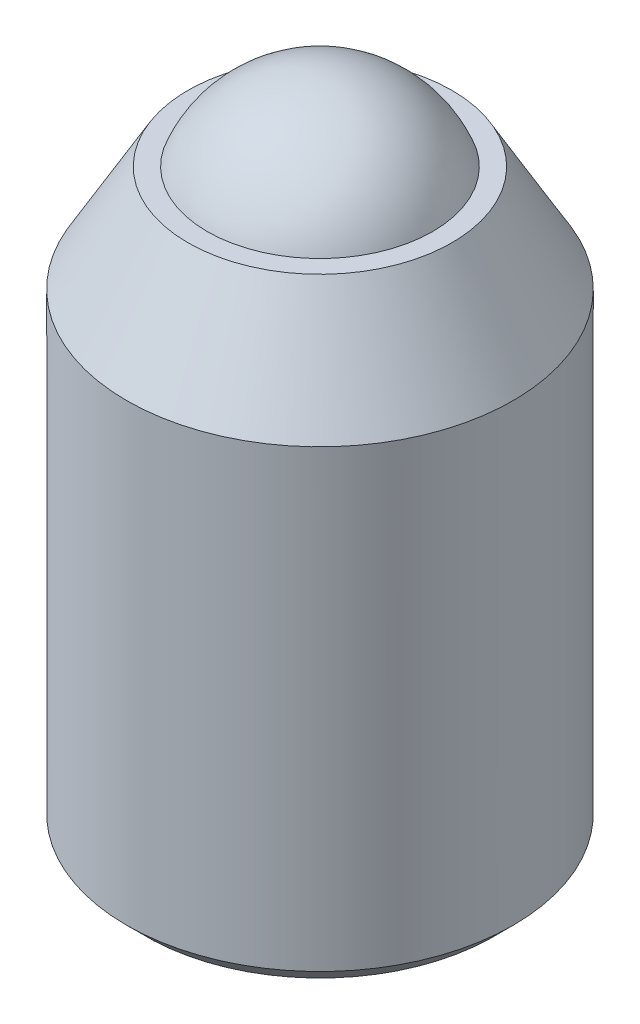
ISO-10303-21;
HEADER;
FILE_DESCRIPTION(('STEP AP214'),'2;1');
FILE_NAME('part.step','',(''),(''),'','','');
FILE_SCHEMA(('AUTOMOTIVE_DESIGN { 1 0 10303 214 1 1 1 1 }'));
ENDSEC;
DATA;
#1=APPLICATION_CONTEXT('core data for automotive mechanical design processes');
#2=APPLICATION_PROTOCOL_DEFINITION('international standard','automotive_design',2000,#1);
#3=PRODUCT_CONTEXT('',#1,'mechanical');
#4=PRODUCT('Part','Part','',(#3));
#5=PRODUCT_RELATED_PRODUCT_CATEGORY('part','',(#4));
#6=PRODUCT_DEFINITION_FORMATION('','',#4);
#7=PRODUCT_DEFINITION_CONTEXT('part definition',#1,'design');
#8=PRODUCT_DEFINITION('design','',#6,#7);
#9=PRODUCT_DEFINITION_SHAPE('','',#8);
#10=(LENGTH_UNIT() NAMED_UNIT(*) SI_UNIT(.MILLI.,.METRE.));
#11=(NAMED_UNIT(*) PLANE_ANGLE_UNIT() SI_UNIT($,.RADIAN.));
#12=(NAMED_UNIT(*) SI_UNIT($,.STERADIAN.) SOLID_ANGLE_UNIT());
#13=UNCERTAINTY_MEASURE_WITH_UNIT(LENGTH_MEASURE(1.E-05),#10,'distance_accuracy_value','');
#14=(GEOMETRIC_REPRESENTATION_CONTEXT(3) GLOBAL_UNCERTAINTY_ASSIGNED_CONTEXT((#13)) GLOBAL_UNIT_ASSIGNED_CONTEXT((#10,
#11,#12)) REPRESENTATION_CONTEXT('',''));
#15=CARTESIAN_POINT('',(0.,0.,0.));
#16=DIRECTION('',(0.,0.,1.));
#17=DIRECTION('',(1.,0.,0.));
#18=AXIS2_PLACEMENT_3D('',#15,#16,#17);
#19=CARTESIAN_POINT('',(0.,5.55,0.));
#20=DIRECTION('',(0.,1.,0.));
#21=DIRECTION('',(1.,0.,0.));
#22=AXIS2_PLACEMENT_3D('',#19,#20,#21);
#23=SPHERICAL_SURFACE('',#22,1.25);
#24=CARTESIAN_POINT('',(0.,6.,0.));
#25=DIRECTION('',(0.,1.,0.));
#26=DIRECTION('',(0.,0.,1.));
#27=AXIS2_PLACEMENT_3D('',#24,#25,#26);
#28=CIRCLE('',#27,1.16619037896906);
#29=CARTESIAN_POINT('',(0.,6.,1.16619037896906));
#30=VERTEX_POINT('',#29);
#31=EDGE_CURVE('E157',#30,#30,#28,.T.);
#32=ORIENTED_EDGE('',*,*,#31,.T.);
#33=EDGE_LOOP('',(#32));
#34=FACE_BOUND('',#33,.T.);
#35=ADVANCED_FACE('F35',(#34),#23,.T.);
#36=CARTESIAN_POINT('',(-1.36619037896906,6.,0.));
#37=DIRECTION('',(0.,1.,0.));
#38=DIRECTION('',(0.,0.,1.));
#39=AXIS2_PLACEMENT_3D('',#36,#37,#38);
#40=PLANE('',#39);
#41=CARTESIAN_POINT('',(0.,6.,0.));
#42=DIRECTION('',(0.,1.,0.));
#43=DIRECTION('',(0.,0.,1.));
#44=AXIS2_PLACEMENT_3D('',#41,#42,#43);
#45=CIRCLE('',#44,1.36619037896906);
#46=CARTESIAN_POINT('',(0.,6.,1.36619037896906));
#47=VERTEX_POINT('',#46);
#48=EDGE_CURVE('E154',#47,#47,#45,.T.);
#49=ORIENTED_EDGE('',*,*,#48,.T.);
#50=EDGE_LOOP('',(#49));
#51=FACE_BOUND('',#50,.T.);
#52=ORIENTED_EDGE('',*,*,#31,.F.);
#53=EDGE_LOOP('',(#52));
#54=FACE_BOUND('',#53,.T.);
#55=ADVANCED_FACE('F231',(#51,#54),#40,.T.);
#56=CARTESIAN_POINT('',(0.,6.,0.));
#57=DIRECTION('',(0.,-1.,0.));
#58=DIRECTION('',(0.,0.,-1.));
#59=AXIS2_PLACEMENT_3D('',#56,#57,#58);
#60=CONICAL_SURFACE('',#59,1.36619037896906,0.5235987755983);
#61=CARTESIAN_POINT('',(0.,4.90220953404844,0.));
#62=DIRECTION('',(0.,1.,0.));
#63=DIRECTION('',(0.,0.,1.));
#64=AXIS2_PLACEMENT_3D('',#61,#62,#63);
#65=CIRCLE('',#64,2.);
#66=CARTESIAN_POINT('',(0.,4.90220953404844,2.));
#67=VERTEX_POINT('',#66);
#68=EDGE_CURVE('E142',#67,#67,#65,.T.);
#69=ORIENTED_EDGE('',*,*,#68,.T.);
#70=EDGE_LOOP('',(#69));
#71=FACE_BOUND('',#70,.T.);
#72=ORIENTED_EDGE('',*,*,#48,.F.);
#73=EDGE_LOOP('',(#72));
#74=FACE_BOUND('',#73,.T.);
#75=ADVANCED_FACE('F237',(#71,#74),#60,.T.);
#76=CARTESIAN_POINT('',(0.,6.8,0.));
#77=DIRECTION('',(0.,1.,0.));
#78=DIRECTION('',(0.,0.,1.));
#79=AXIS2_PLACEMENT_3D('',#76,#77,#78);
#80=CYLINDRICAL_SURFACE('',#79,2.);
#81=CARTESIAN_POINT('',(0.,0.200000000000001,0.));
#82=DIRECTION('',(0.,-1.,0.));
#83=DIRECTION('',(0.,0.,-1.));
#84=AXIS2_PLACEMENT_3D('',#81,#82,#83);
#85=CIRCLE('',#84,2.);
#86=CARTESIAN_POINT('',(0.,0.200000000000001,-2.));
#87=VERTEX_POINT('',#86);
#88=EDGE_CURVE('E160',#87,#87,#85,.F.);
#89=ORIENTED_EDGE('',*,*,#88,.T.);
#90=EDGE_LOOP('',(#89));
#91=FACE_BOUND('',#90,.T.);
#92=ORIENTED_EDGE('',*,*,#68,.F.);
#93=EDGE_LOOP('',(#92));
#94=FACE_BOUND('',#93,.T.);
#95=ADVANCED_FACE('F342',(#91,#94),#80,.T.);
#96=CARTESIAN_POINT('',(0.,0.,0.));
#97=DIRECTION('',(0.,-1.,0.));
#98=DIRECTION('',(0.,0.,-1.));
#99=AXIS2_PLACEMENT_3D('',#96,#97,#98);
#100=PLANE('',#99);
#101=DIRECTION('',(-1.,0.,0.));
#102=VECTOR('',#101,1.);
#103=CARTESIAN_POINT('',(-0.577350269189626,0.,-1.25));
#104=LINE('',#103,#102);
#105=CARTESIAN_POINT('',(0.721687836487033,0.,-1.25));
#106=VERTEX_POINT('',#105);
#107=CARTESIAN_POINT('',(-0.721687836487033,0.,-1.25));
#108=VERTEX_POINT('',#107);
#109=EDGE_CURVE('E177',#106,#108,#104,.T.);
#110=ORIENTED_EDGE('',*,*,#109,.T.);
#111=DIRECTION('',(-0.5,0.,0.866025403784439));
#112=VECTOR('',#111,1.);
#113=CARTESIAN_POINT('',(-1.37120688932536,0.,-0.125000000000001));
#114=LINE('',#113,#112);
#115=CARTESIAN_POINT('',(-1.44337567297407,0.,0.));
#116=VERTEX_POINT('',#115);
#117=EDGE_CURVE('E179',#108,#116,#114,.T.);
#118=ORIENTED_EDGE('',*,*,#117,.T.);
#119=DIRECTION('',(0.5,0.,0.866025403784439));
#120=VECTOR('',#119,1.);
#121=CARTESIAN_POINT('',(-0.793856620135737,0.,1.125));
#122=LINE('',#121,#120);
#123=CARTESIAN_POINT('',(-0.721687836487033,0.,1.25));
#124=VERTEX_POINT('',#123);
#125=EDGE_CURVE('E169',#116,#124,#122,.T.);
#126=ORIENTED_EDGE('',*,*,#125,.T.);
#127=DIRECTION('',(1.,0.,0.));
#128=VECTOR('',#127,1.);
#129=CARTESIAN_POINT('',(0.577350269189625,0.,1.25));
#130=LINE('',#129,#128);
#131=CARTESIAN_POINT('',(0.721687836487033,0.,1.25));
#132=VERTEX_POINT('',#131);
#133=EDGE_CURVE('E171',#124,#132,#130,.T.);
#134=ORIENTED_EDGE('',*,*,#133,.T.);
#135=DIRECTION('',(0.5,0.,-0.866025403784439));
#136=VECTOR('',#135,1.);
#137=CARTESIAN_POINT('',(1.37120688932536,0.,0.125000000000001));
#138=LINE('',#137,#136);
#139=CARTESIAN_POINT('',(1.44337567297407,0.,0.));
#140=VERTEX_POINT('',#139);
#141=EDGE_CURVE('E173',#132,#140,#138,.T.);
#142=ORIENTED_EDGE('',*,*,#141,.T.);
#143=DIRECTION('',(-0.5,0.,-0.866025403784439));
#144=VECTOR('',#143,1.);
#145=CARTESIAN_POINT('',(0.793856620135736,0.,-1.125));
#146=LINE('',#145,#144);
#147=EDGE_CURVE('E175',#140,#106,#146,.T.);
#148=ORIENTED_EDGE('',*,*,#147,.T.);
#149=EDGE_LOOP('',(#110,#118,#126,#134,#142,#148));
#150=FACE_BOUND('',#149,.T.);
#151=CARTESIAN_POINT('',(0.,0.,0.));
#152=DIRECTION('',(0.,-1.,0.));
#153=DIRECTION('',(0.,0.,-1.));
#154=AXIS2_PLACEMENT_3D('',#151,#152,#153);
#155=CIRCLE('',#154,1.8);
#156=CARTESIAN_POINT('',(0.,0.,-1.8));
#157=VERTEX_POINT('',#156);
#158=EDGE_CURVE('E163',#157,#157,#155,.T.);
#159=ORIENTED_EDGE('',*,*,#158,.T.);
#160=EDGE_LOOP('',(#159));
#161=FACE_BOUND('',#160,.T.);
#162=ADVANCED_FACE('F245',(#150,#161),#100,.T.);
#163=CARTESIAN_POINT('',(0.,0.200000000000001,0.));
#164=DIRECTION('',(0.,1.,0.));
#165=DIRECTION('',(0.,0.,1.));
#166=AXIS2_PLACEMENT_3D('',#163,#164,#165);
#167=CONICAL_SURFACE('',#166,2.,0.785398163397448);
#168=ORIENTED_EDGE('',*,*,#158,.F.);
#169=EDGE_LOOP('',(#168));
#170=FACE_BOUND('',#169,.T.);
#171=ORIENTED_EDGE('',*,*,#88,.F.);
#172=EDGE_LOOP('',(#171));
#173=FACE_BOUND('',#172,.T.);
#174=ADVANCED_FACE('F242',(#170,#173),#167,.T.);
#175=CARTESIAN_POINT('',(0.577350269189626,1.5,-1.));
#176=DIRECTION('',(0.866025403784439,0.,-0.5));
#177=DIRECTION('',(-0.5,0.,-0.866025403784439));
#178=AXIS2_PLACEMENT_3D('',#175,#176,#177);
#179=PLANE('',#178);
#180=DIRECTION('',(0.,-1.,0.));
#181=VECTOR('',#180,1.);
#182=CARTESIAN_POINT('',(0.577350269189626,1.5,-1.));
#183=LINE('',#182,#181);
#184=CARTESIAN_POINT('',(0.577350269189626,1.5,-1.));
#185=VERTEX_POINT('',#184);
#186=CARTESIAN_POINT('',(0.577350269189626,0.250000000000001,-1.));
#187=VERTEX_POINT('',#186);
#188=EDGE_CURVE('E140',#185,#187,#183,.T.);
#189=ORIENTED_EDGE('',*,*,#188,.T.);
#190=DIRECTION('',(0.5,0.,0.866025403784439));
#191=VECTOR('',#190,1.);
#192=CARTESIAN_POINT('',(1.15470053837925,0.250000000000001,0.));
#193=LINE('',#192,#191);
#194=CARTESIAN_POINT('',(1.15470053837925,0.250000000000001,0.));
#195=VERTEX_POINT('',#194);
#196=EDGE_CURVE('E114',#187,#195,#193,.T.);
#197=ORIENTED_EDGE('',*,*,#196,.T.);
#198=DIRECTION('',(0.,-1.,0.));
#199=VECTOR('',#198,1.);
#200=CARTESIAN_POINT('',(1.15470053837925,1.5,0.));
#201=LINE('',#200,#199);
#202=CARTESIAN_POINT('',(1.15470053837925,1.5,0.));
#203=VERTEX_POINT('',#202);
#204=EDGE_CURVE('E106',#203,#195,#201,.T.);
#205=ORIENTED_EDGE('',*,*,#204,.F.);
#206=DIRECTION('',(0.5,0.,0.866025403784439));
#207=VECTOR('',#206,1.);
#208=CARTESIAN_POINT('',(0.577350269189626,1.5,-1.));
#209=LINE('',#208,#207);
#210=EDGE_CURVE('E111',#185,#203,#209,.T.);
#211=ORIENTED_EDGE('',*,*,#210,.F.);
#212=EDGE_LOOP('',(#189,#197,#205,#211));
#213=FACE_BOUND('',#212,.T.);
#214=ADVANCED_FACE('F109',(#213),#179,.F.);
#215=CARTESIAN_POINT('',(-0.577350269189626,1.5,-1.));
#216=DIRECTION('',(0.,0.,-1.));
#217=DIRECTION('',(-1.,0.,0.));
#218=AXIS2_PLACEMENT_3D('',#215,#216,#217);
#219=PLANE('',#218);
#220=DIRECTION('',(0.,-1.,0.));
#221=VECTOR('',#220,1.);
#222=CARTESIAN_POINT('',(-0.577350269189626,1.5,-1.));
#223=LINE('',#222,#221);
#224=CARTESIAN_POINT('',(-0.577350269189626,1.5,-1.));
#225=VERTEX_POINT('',#224);
#226=CARTESIAN_POINT('',(-0.577350269189626,0.250000000000001,-1.));
#227=VERTEX_POINT('',#226);
#228=EDGE_CURVE('E143',#225,#227,#223,.T.);
#229=ORIENTED_EDGE('',*,*,#228,.T.);
#230=DIRECTION('',(1.,0.,0.));
#231=VECTOR('',#230,1.);
#232=CARTESIAN_POINT('',(0.577350269189626,0.250000000000001,-1.));
#233=LINE('',#232,#231);
#234=EDGE_CURVE('E182',#227,#187,#233,.T.);
#235=ORIENTED_EDGE('',*,*,#234,.T.);
#236=ORIENTED_EDGE('',*,*,#188,.F.);
#237=DIRECTION('',(1.,0.,0.));
#238=VECTOR('',#237,1.);
#239=CARTESIAN_POINT('',(-0.577350269189626,1.5,-1.));
#240=LINE('',#239,#238);
#241=EDGE_CURVE('E116',#225,#185,#240,.T.);
#242=ORIENTED_EDGE('',*,*,#241,.F.);
#243=EDGE_LOOP('',(#229,#235,#236,#242));
#244=FACE_BOUND('',#243,.T.);
#245=ADVANCED_FACE('F269',(#244),#219,.F.);
#246=CARTESIAN_POINT('',(-1.15470053837925,1.5,0.));
#247=DIRECTION('',(-0.866025403784439,0.,-0.5));
#248=DIRECTION('',(-0.5,0.,0.866025403784439));
#249=AXIS2_PLACEMENT_3D('',#246,#247,#248);
#250=PLANE('',#249);
#251=DIRECTION('',(0.,-1.,0.));
#252=VECTOR('',#251,1.);
#253=CARTESIAN_POINT('',(-1.15470053837925,1.5,0.));
#254=LINE('',#253,#252);
#255=CARTESIAN_POINT('',(-1.15470053837925,1.5,0.));
#256=VERTEX_POINT('',#255);
#257=CARTESIAN_POINT('',(-1.15470053837925,0.250000000000001,0.));
#258=VERTEX_POINT('',#257);
#259=EDGE_CURVE('E146',#256,#258,#254,.T.);
#260=ORIENTED_EDGE('',*,*,#259,.T.);
#261=DIRECTION('',(0.5,0.,-0.866025403784439));
#262=VECTOR('',#261,1.);
#263=CARTESIAN_POINT('',(-0.577350269189626,0.250000000000001,-1.));
#264=LINE('',#263,#262);
#265=EDGE_CURVE('E166',#258,#227,#264,.T.);
#266=ORIENTED_EDGE('',*,*,#265,.T.);
#267=ORIENTED_EDGE('',*,*,#228,.F.);
#268=DIRECTION('',(0.5,0.,-0.866025403784439));
#269=VECTOR('',#268,1.);
#270=CARTESIAN_POINT('',(-1.15470053837925,1.5,0.));
#271=LINE('',#270,#269);
#272=EDGE_CURVE('E137',#256,#225,#271,.T.);
#273=ORIENTED_EDGE('',*,*,#272,.F.);
#274=EDGE_LOOP('',(#260,#266,#267,#273));
#275=FACE_BOUND('',#274,.T.);
#276=ADVANCED_FACE('F220',(#275),#250,.F.);
#277=CARTESIAN_POINT('',(-0.577350269189626,1.5,1.));
#278=DIRECTION('',(-0.866025403784439,0.,0.5));
#279=DIRECTION('',(0.5,0.,0.866025403784439));
#280=AXIS2_PLACEMENT_3D('',#277,#278,#279);
#281=PLANE('',#280);
#282=DIRECTION('',(0.,-1.,0.));
#283=VECTOR('',#282,1.);
#284=CARTESIAN_POINT('',(-0.577350269189626,1.5,1.));
#285=LINE('',#284,#283);
#286=CARTESIAN_POINT('',(-0.577350269189626,1.5,1.));
#287=VERTEX_POINT('',#286);
#288=CARTESIAN_POINT('',(-0.577350269189626,0.250000000000001,1.));
#289=VERTEX_POINT('',#288);
#290=EDGE_CURVE('E149',#287,#289,#285,.T.);
#291=ORIENTED_EDGE('',*,*,#290,.T.);
#292=DIRECTION('',(-0.5,0.,-0.866025403784439));
#293=VECTOR('',#292,1.);
#294=CARTESIAN_POINT('',(-1.15470053837925,0.250000000000001,0.));
#295=LINE('',#294,#293);
#296=EDGE_CURVE('E11',#289,#258,#295,.T.);
#297=ORIENTED_EDGE('',*,*,#296,.T.);
#298=ORIENTED_EDGE('',*,*,#259,.F.);
#299=DIRECTION('',(-0.5,0.,-0.866025403784439));
#300=VECTOR('',#299,1.);
#301=CARTESIAN_POINT('',(-0.577350269189626,1.5,1.));
#302=LINE('',#301,#300);
#303=EDGE_CURVE('E134',#287,#256,#302,.T.);
#304=ORIENTED_EDGE('',*,*,#303,.F.);
#305=EDGE_LOOP('',(#291,#297,#298,#304));
#306=FACE_BOUND('',#305,.T.);
#307=ADVANCED_FACE('F216',(#306),#281,.F.);
#308=CARTESIAN_POINT('',(0.577350269189625,1.5,1.));
#309=DIRECTION('',(0.,0.,1.));
#310=DIRECTION('',(1.,0.,0.));
#311=AXIS2_PLACEMENT_3D('',#308,#309,#310);
#312=PLANE('',#311);
#313=DIRECTION('',(0.,-1.,0.));
#314=VECTOR('',#313,1.);
#315=CARTESIAN_POINT('',(0.577350269189625,1.5,1.));
#316=LINE('',#315,#314);
#317=CARTESIAN_POINT('',(0.577350269189625,1.5,1.));
#318=VERTEX_POINT('',#317);
#319=CARTESIAN_POINT('',(0.577350269189625,0.250000000000001,1.));
#320=VERTEX_POINT('',#319);
#321=EDGE_CURVE('E115',#318,#320,#316,.T.);
#322=ORIENTED_EDGE('',*,*,#321,.T.);
#323=DIRECTION('',(-1.,0.,0.));
#324=VECTOR('',#323,1.);
#325=CARTESIAN_POINT('',(-0.577350269189626,0.250000000000001,1.));
#326=LINE('',#325,#324);
#327=EDGE_CURVE('E44',#320,#289,#326,.T.);
#328=ORIENTED_EDGE('',*,*,#327,.T.);
#329=ORIENTED_EDGE('',*,*,#290,.F.);
#330=DIRECTION('',(-1.,0.,0.));
#331=VECTOR('',#330,1.);
#332=CARTESIAN_POINT('',(0.577350269189625,1.5,1.));
#333=LINE('',#332,#331);
#334=EDGE_CURVE('E124',#318,#287,#333,.T.);
#335=ORIENTED_EDGE('',*,*,#334,.F.);
#336=EDGE_LOOP('',(#322,#328,#329,#335));
#337=FACE_BOUND('',#336,.T.);
#338=ADVANCED_FACE('F221',(#337),#312,.F.);
#339=CARTESIAN_POINT('',(1.15470053837925,1.5,0.));
#340=DIRECTION('',(0.866025403784439,0.,0.5));
#341=DIRECTION('',(0.5,0.,-0.866025403784439));
#342=AXIS2_PLACEMENT_3D('',#339,#340,#341);
#343=PLANE('',#342);
#344=ORIENTED_EDGE('',*,*,#204,.T.);
#345=DIRECTION('',(-0.5,0.,0.866025403784439));
#346=VECTOR('',#345,1.);
#347=CARTESIAN_POINT('',(0.577350269189625,0.250000000000001,1.));
#348=LINE('',#347,#346);
#349=EDGE_CURVE('E59',#195,#320,#348,.T.);
#350=ORIENTED_EDGE('',*,*,#349,.T.);
#351=ORIENTED_EDGE('',*,*,#321,.F.);
#352=DIRECTION('',(-0.5,0.,0.866025403784438));
#353=VECTOR('',#352,1.);
#354=CARTESIAN_POINT('',(1.15470053837925,1.5,0.));
#355=LINE('',#354,#353);
#356=EDGE_CURVE('E119',#203,#318,#355,.T.);
#357=ORIENTED_EDGE('',*,*,#356,.F.);
#358=EDGE_LOOP('',(#344,#350,#351,#357));
#359=FACE_BOUND('',#358,.T.);
#360=ADVANCED_FACE('F120',(#359),#343,.F.);
#361=CARTESIAN_POINT('',(0.,1.5,0.));
#362=DIRECTION('',(0.,-1.,0.));
#363=DIRECTION('',(0.,0.,-1.));
#364=AXIS2_PLACEMENT_3D('',#361,#362,#363);
#365=PLANE('',#364);
#366=ORIENTED_EDGE('',*,*,#210,.T.);
#367=ORIENTED_EDGE('',*,*,#356,.T.);
#368=ORIENTED_EDGE('',*,*,#334,.T.);
#369=ORIENTED_EDGE('',*,*,#303,.T.);
#370=ORIENTED_EDGE('',*,*,#272,.T.);
#371=ORIENTED_EDGE('',*,*,#241,.T.);
#372=EDGE_LOOP('',(#366,#367,#368,#369,#370,#371));
#373=FACE_BOUND('',#372,.T.);
#374=ADVANCED_FACE('F126',(#373),#365,.T.);
#375=CARTESIAN_POINT('',(1.15470053837925,0.250000000000001,0.));
#376=DIRECTION('',(-0.612372435695794,-0.707106781186548,-0.353553390593273));
#377=DIRECTION('',(0.5,0.,-0.866025403784439));
#378=AXIS2_PLACEMENT_3D('',#375,#376,#377);
#379=PLANE('',#378);
#380=DIRECTION('',(0.755928946018455,-0.654653670707977,0.));
#381=VECTOR('',#380,1.);
#382=CARTESIAN_POINT('',(0.824786098842321,0.535714285714288,0.));
#383=LINE('',#382,#381);
#384=EDGE_CURVE('E131',#140,#195,#383,.F.);
#385=ORIENTED_EDGE('',*,*,#384,.F.);
#386=ORIENTED_EDGE('',*,*,#141,.F.);
#387=DIRECTION('',(0.377964473009229,-0.654653670707977,0.654653670707977));
#388=VECTOR('',#387,1.);
#389=CARTESIAN_POINT('',(0.412393049421161,0.535714285714286,0.714285714285716));
#390=LINE('',#389,#388);
#391=EDGE_CURVE('E39',#320,#132,#390,.T.);
#392=ORIENTED_EDGE('',*,*,#391,.F.);
#393=ORIENTED_EDGE('',*,*,#349,.F.);
#394=EDGE_LOOP('',(#385,#386,#392,#393));
#395=FACE_BOUND('',#394,.T.);
#396=ADVANCED_FACE('F37',(#395),#379,.T.);
#397=CARTESIAN_POINT('',(0.577350269189625,0.250000000000001,1.));
#398=DIRECTION('',(0.,-0.707106781186548,-0.707106781186547));
#399=DIRECTION('',(1.,0.,0.));
#400=AXIS2_PLACEMENT_3D('',#397,#398,#399);
#401=PLANE('',#400);
#402=ORIENTED_EDGE('',*,*,#391,.T.);
#403=ORIENTED_EDGE('',*,*,#133,.F.);
#404=DIRECTION('',(-0.377964473009227,-0.654653670707977,0.654653670707977));
#405=VECTOR('',#404,1.);
#406=CARTESIAN_POINT('',(-0.412393049421162,0.535714285714286,0.714285714285716));
#407=LINE('',#406,#405);
#408=EDGE_CURVE('E194',#289,#124,#407,.T.);
#409=ORIENTED_EDGE('',*,*,#408,.F.);
#410=ORIENTED_EDGE('',*,*,#327,.F.);
#411=EDGE_LOOP('',(#402,#403,#409,#410));
#412=FACE_BOUND('',#411,.T.);
#413=ADVANCED_FACE('F208',(#412),#401,.T.);
#414=CARTESIAN_POINT('',(0.577350269189626,0.250000000000001,-1.));
#415=DIRECTION('',(-0.612372435695795,-0.707106781186548,0.353553390593274));
#416=DIRECTION('',(-0.5,0.,-0.866025403784439));
#417=AXIS2_PLACEMENT_3D('',#414,#415,#416);
#418=PLANE('',#417);
#419=ORIENTED_EDGE('',*,*,#384,.T.);
#420=ORIENTED_EDGE('',*,*,#196,.F.);
#421=DIRECTION('',(0.377964473009227,-0.654653670707977,-0.654653670707978));
#422=VECTOR('',#421,1.);
#423=CARTESIAN_POINT('',(0.412393049421161,0.535714285714287,-0.714285714285715));
#424=LINE('',#423,#422);
#425=EDGE_CURVE('E191',#106,#187,#424,.F.);
#426=ORIENTED_EDGE('',*,*,#425,.F.);
#427=ORIENTED_EDGE('',*,*,#147,.F.);
#428=EDGE_LOOP('',(#419,#420,#426,#427));
#429=FACE_BOUND('',#428,.T.);
#430=ADVANCED_FACE('F200',(#429),#418,.T.);
#431=CARTESIAN_POINT('',(-0.577350269189626,0.250000000000001,1.));
#432=DIRECTION('',(0.612372435695795,-0.707106781186547,-0.353553390593274));
#433=DIRECTION('',(0.5,0.,0.866025403784439));
#434=AXIS2_PLACEMENT_3D('',#431,#432,#433);
#435=PLANE('',#434);
#436=ORIENTED_EDGE('',*,*,#408,.T.);
#437=ORIENTED_EDGE('',*,*,#125,.F.);
#438=DIRECTION('',(0.755928946018454,0.654653670707977,0.));
#439=VECTOR('',#438,1.);
#440=CARTESIAN_POINT('',(-1.15470053837925,0.250000000000001,0.));
#441=LINE('',#440,#439);
#442=EDGE_CURVE('E189',#258,#116,#441,.F.);
#443=ORIENTED_EDGE('',*,*,#442,.F.);
#444=ORIENTED_EDGE('',*,*,#296,.F.);
#445=EDGE_LOOP('',(#436,#437,#443,#444));
#446=FACE_BOUND('',#445,.T.);
#447=ADVANCED_FACE('F213',(#446),#435,.T.);
#448=CARTESIAN_POINT('',(-0.577350269189626,0.250000000000001,-1.));
#449=DIRECTION('',(0.,-0.707106781186548,0.707106781186547));
#450=DIRECTION('',(-1.,0.,0.));
#451=AXIS2_PLACEMENT_3D('',#448,#449,#450);
#452=PLANE('',#451);
#453=ORIENTED_EDGE('',*,*,#425,.T.);
#454=ORIENTED_EDGE('',*,*,#234,.F.);
#455=DIRECTION('',(-0.377964473009227,-0.654653670707977,-0.654653670707977));
#456=VECTOR('',#455,1.);
#457=CARTESIAN_POINT('',(-0.412393049421162,0.535714285714287,-0.714285714285714));
#458=LINE('',#457,#456);
#459=EDGE_CURVE('E187',#108,#227,#458,.F.);
#460=ORIENTED_EDGE('',*,*,#459,.F.);
#461=ORIENTED_EDGE('',*,*,#109,.F.);
#462=EDGE_LOOP('',(#453,#454,#460,#461));
#463=FACE_BOUND('',#462,.T.);
#464=ADVANCED_FACE('F250',(#463),#452,.T.);
#465=CARTESIAN_POINT('',(-1.15470053837925,0.250000000000001,0.));
#466=DIRECTION('',(0.612372435695795,-0.707106781186548,0.353553390593274));
#467=DIRECTION('',(-0.5,0.,0.866025403784439));
#468=AXIS2_PLACEMENT_3D('',#465,#466,#467);
#469=PLANE('',#468);
#470=ORIENTED_EDGE('',*,*,#442,.T.);
#471=ORIENTED_EDGE('',*,*,#117,.F.);
#472=ORIENTED_EDGE('',*,*,#459,.T.);
#473=ORIENTED_EDGE('',*,*,#265,.F.);
#474=EDGE_LOOP('',(#470,#471,#472,#473));
#475=FACE_BOUND('',#474,.T.);
#476=ADVANCED_FACE('F247',(#475),#469,.T.);
#477=CLOSED_SHELL('',(#35,#55,#75,#95,#162,#174,#214,#245,#276,#307,#338,#360,#374,#396,#413,
#430,#447,#464,#476));
#478=MANIFOLD_SOLID_BREP('B2',#477);
#479=ADVANCED_BREP_SHAPE_REPRESENTATION('',(#18,#478),#14);
#480=SHAPE_DEFINITION_REPRESENTATION(#9,#479);
ENDSEC;
END-ISO-10303-21;
